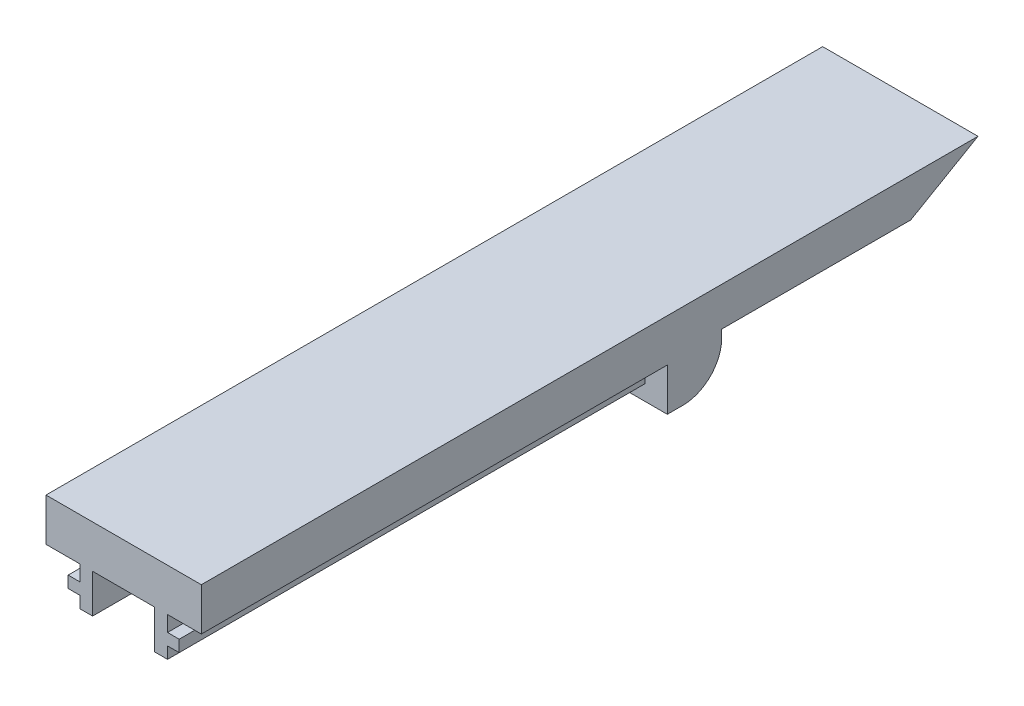
ISO-10303-21;
HEADER;
FILE_DESCRIPTION(('STEP AP214'),'2;1');
FILE_NAME('part.step','',(''),(''),'','','');
FILE_SCHEMA(('AUTOMOTIVE_DESIGN { 1 0 10303 214 1 1 1 1 }'));
ENDSEC;
DATA;
#1=APPLICATION_CONTEXT('core data for automotive mechanical design processes');
#2=APPLICATION_PROTOCOL_DEFINITION('international standard','automotive_design',2000,#1);
#3=PRODUCT_CONTEXT('',#1,'mechanical');
#4=PRODUCT('Part','Part','',(#3));
#5=PRODUCT_RELATED_PRODUCT_CATEGORY('part','',(#4));
#6=PRODUCT_DEFINITION_FORMATION('','',#4);
#7=PRODUCT_DEFINITION_CONTEXT('part definition',#1,'design');
#8=PRODUCT_DEFINITION('design','',#6,#7);
#9=PRODUCT_DEFINITION_SHAPE('','',#8);
#10=(LENGTH_UNIT() NAMED_UNIT(*) SI_UNIT(.MILLI.,.METRE.));
#11=(NAMED_UNIT(*) PLANE_ANGLE_UNIT() SI_UNIT($,.RADIAN.));
#12=(NAMED_UNIT(*) SI_UNIT($,.STERADIAN.) SOLID_ANGLE_UNIT());
#13=UNCERTAINTY_MEASURE_WITH_UNIT(LENGTH_MEASURE(1.E-05),#10,'distance_accuracy_value','');
#14=(GEOMETRIC_REPRESENTATION_CONTEXT(3) GLOBAL_UNCERTAINTY_ASSIGNED_CONTEXT((#13)) GLOBAL_UNIT_ASSIGNED_CONTEXT((#10,
#11,#12)) REPRESENTATION_CONTEXT('',''));
#15=CARTESIAN_POINT('',(0.,0.,0.));
#16=DIRECTION('',(0.,0.,1.));
#17=DIRECTION('',(1.,0.,0.));
#18=AXIS2_PLACEMENT_3D('',#15,#16,#17);
#19=CARTESIAN_POINT('',(0.,-33.3836724238589,-19.2740722604533));
#20=DIRECTION('',(0.,-0.866025403784438,-0.500000000000001));
#21=DIRECTION('',(0.,0.500000000000001,-0.866025403784438));
#22=AXIS2_PLACEMENT_3D('',#19,#20,#21);
#23=PLANE('',#22);
#24=DIRECTION('',(0.,0.500000000000001,-0.866025403784438));
#25=VECTOR('',#24,1.);
#26=CARTESIAN_POINT('',(-6.53631284916201,12.4734636871508,-98.7009618943233));
#27=LINE('',#26,#25);
#28=CARTESIAN_POINT('',(-6.53631284916201,8.22346368715084,-91.3397459621556));
#29=VERTEX_POINT('',#28);
#30=CARTESIAN_POINT('',(-6.53631284916201,13.2234636871508,-100.));
#31=VERTEX_POINT('',#30);
#32=EDGE_CURVE('E231',#29,#31,#27,.T.);
#33=ORIENTED_EDGE('',*,*,#32,.F.);
#34=DIRECTION('',(-1.,0.,0.));
#35=VECTOR('',#34,1.);
#36=CARTESIAN_POINT('',(0.,8.22346368715084,-91.3397459621556));
#37=LINE('',#36,#35);
#38=CARTESIAN_POINT('',(-26.536312849162,8.22346368715084,-91.3397459621556));
#39=VERTEX_POINT('',#38);
#40=EDGE_CURVE('E210',#29,#39,#37,.T.);
#41=ORIENTED_EDGE('',*,*,#40,.T.);
#42=DIRECTION('',(0.,-0.500000000000001,0.866025403784438));
#43=VECTOR('',#42,1.);
#44=CARTESIAN_POINT('',(-26.536312849162,12.4734636871508,-98.7009618943233));
#45=LINE('',#44,#43);
#46=CARTESIAN_POINT('',(-26.536312849162,13.2234636871508,-100.));
#47=VERTEX_POINT('',#46);
#48=EDGE_CURVE('E236',#47,#39,#45,.T.);
#49=ORIENTED_EDGE('',*,*,#48,.F.);
#50=DIRECTION('',(-1.,0.,0.));
#51=VECTOR('',#50,1.);
#52=CARTESIAN_POINT('',(-6.53631284916201,13.2234636871508,-100.));
#53=LINE('',#52,#51);
#54=EDGE_CURVE('E252',#31,#47,#53,.T.);
#55=ORIENTED_EDGE('',*,*,#54,.F.);
#56=EDGE_LOOP('',(#33,#41,#49,#55));
#57=FACE_BOUND('',#56,.T.);
#58=ADVANCED_FACE('F38',(#57),#23,.T.);
#59=CARTESIAN_POINT('',(-26.536312849162,2.22346368715084,-100.));
#60=DIRECTION('',(0.,-1.,0.));
#61=DIRECTION('',(0.,0.,-1.));
#62=AXIS2_PLACEMENT_3D('',#59,#60,#61);
#63=PLANE('',#62);
#64=DIRECTION('',(0.,0.,1.));
#65=VECTOR('',#64,1.);
#66=CARTESIAN_POINT('',(-26.536312849162,2.22346368715084,-100.));
#67=LINE('',#66,#65);
#68=CARTESIAN_POINT('',(-26.536312849162,2.22346368715084,-62.));
#69=VERTEX_POINT('',#68);
#70=CARTESIAN_POINT('',(-26.536312849162,2.22346368715084,-60.));
#71=VERTEX_POINT('',#70);
#72=EDGE_CURVE('E465',#69,#71,#67,.T.);
#73=ORIENTED_EDGE('',*,*,#72,.F.);
#74=DIRECTION('',(-1.,0.,0.));
#75=VECTOR('',#74,1.);
#76=CARTESIAN_POINT('',(-6.53631284916201,2.22346368715084,-62.));
#77=LINE('',#76,#75);
#78=CARTESIAN_POINT('',(-6.53631284916201,2.22346368715084,-62.));
#79=VERTEX_POINT('',#78);
#80=EDGE_CURVE('E47',#69,#79,#77,.F.);
#81=ORIENTED_EDGE('',*,*,#80,.T.);
#82=DIRECTION('',(0.,0.,1.));
#83=VECTOR('',#82,1.);
#84=CARTESIAN_POINT('',(-6.53631284916201,2.22346368715084,-100.));
#85=LINE('',#84,#83);
#86=CARTESIAN_POINT('',(-6.53631284916201,2.22346368715084,-60.));
#87=VERTEX_POINT('',#86);
#88=EDGE_CURVE('E466',#79,#87,#85,.T.);
#89=ORIENTED_EDGE('',*,*,#88,.T.);
#90=DIRECTION('',(1.,0.,0.));
#91=VECTOR('',#90,1.);
#92=CARTESIAN_POINT('',(-26.536312849162,2.22346368715084,-60.));
#93=LINE('',#92,#91);
#94=EDGE_CURVE('E261',#71,#87,#93,.T.);
#95=ORIENTED_EDGE('',*,*,#94,.F.);
#96=EDGE_LOOP('',(#73,#81,#89,#95));
#97=FACE_BOUND('',#96,.T.);
#98=ADVANCED_FACE('F505',(#97),#63,.T.);
#99=CARTESIAN_POINT('',(-26.536312849162,10.2234636871508,-100.));
#100=DIRECTION('',(-1.,0.,0.));
#101=DIRECTION('',(0.,0.,1.));
#102=AXIS2_PLACEMENT_3D('',#99,#100,#101);
#103=PLANE('',#102);
#104=DIRECTION('',(0.,-1.,0.));
#105=VECTOR('',#104,1.);
#106=CARTESIAN_POINT('',(-26.536312849162,8.22346368715084,-67.));
#107=LINE('',#106,#105);
#108=CARTESIAN_POINT('',(-26.536312849162,8.22346368715084,-67.));
#109=VERTEX_POINT('',#108);
#110=CARTESIAN_POINT('',(-26.536312849162,7.22346368715084,-67.));
#111=VERTEX_POINT('',#110);
#112=EDGE_CURVE('E223',#109,#111,#107,.T.);
#113=ORIENTED_EDGE('',*,*,#112,.T.);
#114=CARTESIAN_POINT('',(-26.536312849162,7.22346368715084,-62.));
#115=DIRECTION('',(-1.,0.,0.));
#116=DIRECTION('',(0.,0.,1.));
#117=AXIS2_PLACEMENT_3D('',#114,#115,#116);
#118=CIRCLE('',#117,5.);
#119=EDGE_CURVE('E61',#111,#69,#118,.T.);
#120=ORIENTED_EDGE('',*,*,#119,.T.);
#121=ORIENTED_EDGE('',*,*,#72,.T.);
#122=DIRECTION('',(0.,-1.,0.));
#123=VECTOR('',#122,1.);
#124=CARTESIAN_POINT('',(-26.536312849162,7.72346368715084,-60.));
#125=LINE('',#124,#123);
#126=CARTESIAN_POINT('',(-26.536312849162,7.72346368715084,-60.));
#127=VERTEX_POINT('',#126);
#128=EDGE_CURVE('E257',#127,#71,#125,.T.);
#129=ORIENTED_EDGE('',*,*,#128,.F.);
#130=DIRECTION('',(0.,0.,1.));
#131=VECTOR('',#130,1.);
#132=CARTESIAN_POINT('',(-26.536312849162,7.72346368715084,-60.));
#133=LINE('',#132,#131);
#134=CARTESIAN_POINT('',(-26.536312849162,7.72346368715084,0.));
#135=VERTEX_POINT('',#134);
#136=EDGE_CURVE('E404',#127,#135,#133,.T.);
#137=ORIENTED_EDGE('',*,*,#136,.T.);
#138=DIRECTION('',(0.,-1.,0.));
#139=VECTOR('',#138,1.);
#140=CARTESIAN_POINT('',(-26.536312849162,10.2234636871508,0.));
#141=LINE('',#140,#139);
#142=CARTESIAN_POINT('',(-26.536312849162,13.2234636871508,0.));
#143=VERTEX_POINT('',#142);
#144=EDGE_CURVE('E408',#143,#135,#141,.T.);
#145=ORIENTED_EDGE('',*,*,#144,.F.);
#146=DIRECTION('',(0.,0.,1.));
#147=VECTOR('',#146,1.);
#148=CARTESIAN_POINT('',(-26.536312849162,13.2234636871508,-100.));
#149=LINE('',#148,#147);
#150=EDGE_CURVE('E240',#47,#143,#149,.T.);
#151=ORIENTED_EDGE('',*,*,#150,.F.);
#152=ORIENTED_EDGE('',*,*,#48,.T.);
#153=DIRECTION('',(0.,0.,-1.));
#154=VECTOR('',#153,1.);
#155=CARTESIAN_POINT('',(-26.536312849162,8.22346368715084,-67.));
#156=LINE('',#155,#154);
#157=EDGE_CURVE('E215',#109,#39,#156,.T.);
#158=ORIENTED_EDGE('',*,*,#157,.F.);
#159=EDGE_LOOP('',(#113,#120,#121,#129,#137,#145,#151,#152,#158));
#160=FACE_BOUND('',#159,.T.);
#161=ADVANCED_FACE('F479',(#160),#103,.T.);
#162=CARTESIAN_POINT('',(-6.53631284916201,10.2234636871508,-100.));
#163=DIRECTION('',(1.,0.,0.));
#164=DIRECTION('',(0.,1.,0.));
#165=AXIS2_PLACEMENT_3D('',#162,#163,#164);
#166=PLANE('',#165);
#167=ORIENTED_EDGE('',*,*,#88,.F.);
#168=CARTESIAN_POINT('',(-6.53631284916201,7.22346368715084,-62.));
#169=DIRECTION('',(1.,0.,0.));
#170=DIRECTION('',(0.,1.,0.));
#171=AXIS2_PLACEMENT_3D('',#168,#169,#170);
#172=CIRCLE('',#171,5.);
#173=CARTESIAN_POINT('',(-6.53631284916201,7.22346368715084,-67.));
#174=VERTEX_POINT('',#173);
#175=EDGE_CURVE('E11',#79,#174,#172,.T.);
#176=ORIENTED_EDGE('',*,*,#175,.T.);
#177=DIRECTION('',(0.,-1.,0.));
#178=VECTOR('',#177,1.);
#179=CARTESIAN_POINT('',(-6.53631284916201,8.22346368715084,-67.));
#180=LINE('',#179,#178);
#181=CARTESIAN_POINT('',(-6.53631284916201,8.22346368715084,-67.));
#182=VERTEX_POINT('',#181);
#183=EDGE_CURVE('E221',#182,#174,#180,.T.);
#184=ORIENTED_EDGE('',*,*,#183,.F.);
#185=DIRECTION('',(0.,0.,1.));
#186=VECTOR('',#185,1.);
#187=CARTESIAN_POINT('',(-6.53631284916201,8.22346368715084,-67.));
#188=LINE('',#187,#186);
#189=EDGE_CURVE('E204',#29,#182,#188,.T.);
#190=ORIENTED_EDGE('',*,*,#189,.F.);
#191=ORIENTED_EDGE('',*,*,#32,.T.);
#192=DIRECTION('',(0.,0.,-1.));
#193=VECTOR('',#192,1.);
#194=CARTESIAN_POINT('',(-6.53631284916201,13.2234636871508,0.));
#195=LINE('',#194,#193);
#196=CARTESIAN_POINT('',(-6.53631284916201,13.2234636871508,0.));
#197=VERTEX_POINT('',#196);
#198=EDGE_CURVE('E248',#197,#31,#195,.T.);
#199=ORIENTED_EDGE('',*,*,#198,.F.);
#200=DIRECTION('',(0.,1.,0.));
#201=VECTOR('',#200,1.);
#202=CARTESIAN_POINT('',(-6.53631284916201,10.2234636871508,0.));
#203=LINE('',#202,#201);
#204=CARTESIAN_POINT('',(-6.53631284916201,7.72346368715084,0.));
#205=VERTEX_POINT('',#204);
#206=EDGE_CURVE('E462',#205,#197,#203,.T.);
#207=ORIENTED_EDGE('',*,*,#206,.F.);
#208=DIRECTION('',(0.,0.,1.));
#209=VECTOR('',#208,1.);
#210=CARTESIAN_POINT('',(-6.53631284916202,7.72346368715084,-60.));
#211=LINE('',#210,#209);
#212=CARTESIAN_POINT('',(-6.53631284916202,7.72346368715084,-60.));
#213=VERTEX_POINT('',#212);
#214=EDGE_CURVE('E338',#213,#205,#211,.T.);
#215=ORIENTED_EDGE('',*,*,#214,.F.);
#216=DIRECTION('',(0.,1.,0.));
#217=VECTOR('',#216,1.);
#218=CARTESIAN_POINT('',(-6.53631284916202,7.72346368715084,-60.));
#219=LINE('',#218,#217);
#220=EDGE_CURVE('E266',#87,#213,#219,.T.);
#221=ORIENTED_EDGE('',*,*,#220,.F.);
#222=EDGE_LOOP('',(#167,#176,#184,#190,#191,#199,#207,#215,#221));
#223=FACE_BOUND('',#222,.T.);
#224=ADVANCED_FACE('F226',(#223),#166,.T.);
#225=CARTESIAN_POINT('',(0.,0.,0.));
#226=DIRECTION('',(0.,0.,1.));
#227=DIRECTION('',(1.,0.,0.));
#228=AXIS2_PLACEMENT_3D('',#225,#226,#227);
#229=PLANE('',#228);
#230=DIRECTION('',(-1.,0.,0.));
#231=VECTOR('',#230,1.);
#232=CARTESIAN_POINT('',(-26.536312849162,7.72346368715084,0.));
#233=LINE('',#232,#231);
#234=CARTESIAN_POINT('',(-22.186312849162,7.72346368715084,0.));
#235=VERTEX_POINT('',#234);
#236=EDGE_CURVE('E262',#235,#135,#233,.T.);
#237=ORIENTED_EDGE('',*,*,#236,.F.);
#238=DIRECTION('',(0.,1.,0.));
#239=VECTOR('',#238,1.);
#240=CARTESIAN_POINT('',(-22.186312849162,7.72346368715084,0.));
#241=LINE('',#240,#239);
#242=CARTESIAN_POINT('',(-22.186312849162,5.72346368715084,0.));
#243=VERTEX_POINT('',#242);
#244=EDGE_CURVE('E398',#243,#235,#241,.T.);
#245=ORIENTED_EDGE('',*,*,#244,.F.);
#246=DIRECTION('',(1.,0.,0.));
#247=VECTOR('',#246,1.);
#248=CARTESIAN_POINT('',(-22.186312849162,5.72346368715084,0.));
#249=LINE('',#248,#247);
#250=CARTESIAN_POINT('',(-23.686312849162,5.72346368715084,0.));
#251=VERTEX_POINT('',#250);
#252=EDGE_CURVE('E394',#251,#243,#249,.T.);
#253=ORIENTED_EDGE('',*,*,#252,.F.);
#254=DIRECTION('',(0.,1.,0.));
#255=VECTOR('',#254,1.);
#256=CARTESIAN_POINT('',(-23.686312849162,5.72346368715084,0.));
#257=LINE('',#256,#255);
#258=CARTESIAN_POINT('',(-23.686312849162,4.22346368715084,0.));
#259=VERTEX_POINT('',#258);
#260=EDGE_CURVE('E390',#259,#251,#257,.T.);
#261=ORIENTED_EDGE('',*,*,#260,.F.);
#262=DIRECTION('',(-1.,0.,0.));
#263=VECTOR('',#262,1.);
#264=CARTESIAN_POINT('',(-23.686312849162,4.22346368715084,0.));
#265=LINE('',#264,#263);
#266=CARTESIAN_POINT('',(-22.186312849162,4.22346368715084,0.));
#267=VERTEX_POINT('',#266);
#268=EDGE_CURVE('E386',#267,#259,#265,.T.);
#269=ORIENTED_EDGE('',*,*,#268,.F.);
#270=DIRECTION('',(0.,1.,0.));
#271=VECTOR('',#270,1.);
#272=CARTESIAN_POINT('',(-22.186312849162,4.22346368715084,0.));
#273=LINE('',#272,#271);
#274=CARTESIAN_POINT('',(-22.186312849162,2.72346368715084,0.));
#275=VERTEX_POINT('',#274);
#276=EDGE_CURVE('E382',#275,#267,#273,.T.);
#277=ORIENTED_EDGE('',*,*,#276,.F.);
#278=DIRECTION('',(-1.,0.,0.));
#279=VECTOR('',#278,1.);
#280=CARTESIAN_POINT('',(-22.186312849162,2.72346368715084,0.));
#281=LINE('',#280,#279);
#282=CARTESIAN_POINT('',(-20.536312849162,2.72346368715084,0.));
#283=VERTEX_POINT('',#282);
#284=EDGE_CURVE('E378',#283,#275,#281,.T.);
#285=ORIENTED_EDGE('',*,*,#284,.F.);
#286=DIRECTION('',(0.,-1.,0.));
#287=VECTOR('',#286,1.);
#288=CARTESIAN_POINT('',(-20.536312849162,2.72346368715084,0.));
#289=LINE('',#288,#287);
#290=CARTESIAN_POINT('',(-20.536312849162,7.72346368715084,0.));
#291=VERTEX_POINT('',#290);
#292=EDGE_CURVE('E374',#291,#283,#289,.T.);
#293=ORIENTED_EDGE('',*,*,#292,.F.);
#294=DIRECTION('',(-1.,0.,0.));
#295=VECTOR('',#294,1.);
#296=CARTESIAN_POINT('',(-20.536312849162,7.72346368715084,0.));
#297=LINE('',#296,#295);
#298=CARTESIAN_POINT('',(-12.536312849162,7.72346368715084,0.));
#299=VERTEX_POINT('',#298);
#300=EDGE_CURVE('E370',#299,#291,#297,.T.);
#301=ORIENTED_EDGE('',*,*,#300,.F.);
#302=DIRECTION('',(0.,1.,0.));
#303=VECTOR('',#302,1.);
#304=CARTESIAN_POINT('',(-12.536312849162,2.72346368715084,0.));
#305=LINE('',#304,#303);
#306=CARTESIAN_POINT('',(-12.536312849162,2.72346368715084,0.));
#307=VERTEX_POINT('',#306);
#308=EDGE_CURVE('E366',#307,#299,#305,.T.);
#309=ORIENTED_EDGE('',*,*,#308,.F.);
#310=DIRECTION('',(-1.,0.,0.));
#311=VECTOR('',#310,1.);
#312=CARTESIAN_POINT('',(-10.886312849162,2.72346368715084,0.));
#313=LINE('',#312,#311);
#314=CARTESIAN_POINT('',(-10.886312849162,2.72346368715084,0.));
#315=VERTEX_POINT('',#314);
#316=EDGE_CURVE('E362',#315,#307,#313,.T.);
#317=ORIENTED_EDGE('',*,*,#316,.F.);
#318=DIRECTION('',(0.,-1.,0.));
#319=VECTOR('',#318,1.);
#320=CARTESIAN_POINT('',(-10.886312849162,4.22346368715084,0.));
#321=LINE('',#320,#319);
#322=CARTESIAN_POINT('',(-10.886312849162,4.22346368715084,0.));
#323=VERTEX_POINT('',#322);
#324=EDGE_CURVE('E358',#323,#315,#321,.T.);
#325=ORIENTED_EDGE('',*,*,#324,.F.);
#326=DIRECTION('',(-1.,0.,0.));
#327=VECTOR('',#326,1.);
#328=CARTESIAN_POINT('',(-9.38631284916202,4.22346368715084,0.));
#329=LINE('',#328,#327);
#330=CARTESIAN_POINT('',(-9.38631284916202,4.22346368715084,0.));
#331=VERTEX_POINT('',#330);
#332=EDGE_CURVE('E354',#331,#323,#329,.T.);
#333=ORIENTED_EDGE('',*,*,#332,.F.);
#334=DIRECTION('',(0.,-1.,0.));
#335=VECTOR('',#334,1.);
#336=CARTESIAN_POINT('',(-9.38631284916202,5.72346368715084,0.));
#337=LINE('',#336,#335);
#338=CARTESIAN_POINT('',(-9.38631284916202,5.72346368715084,0.));
#339=VERTEX_POINT('',#338);
#340=EDGE_CURVE('E350',#339,#331,#337,.T.);
#341=ORIENTED_EDGE('',*,*,#340,.F.);
#342=DIRECTION('',(1.,0.,0.));
#343=VECTOR('',#342,1.);
#344=CARTESIAN_POINT('',(-10.886312849162,5.72346368715084,0.));
#345=LINE('',#344,#343);
#346=CARTESIAN_POINT('',(-10.886312849162,5.72346368715084,0.));
#347=VERTEX_POINT('',#346);
#348=EDGE_CURVE('E346',#347,#339,#345,.T.);
#349=ORIENTED_EDGE('',*,*,#348,.F.);
#350=DIRECTION('',(0.,-1.,0.));
#351=VECTOR('',#350,1.);
#352=CARTESIAN_POINT('',(-10.886312849162,7.72346368715084,0.));
#353=LINE('',#352,#351);
#354=CARTESIAN_POINT('',(-10.886312849162,7.72346368715084,0.));
#355=VERTEX_POINT('',#354);
#356=EDGE_CURVE('E342',#355,#347,#353,.T.);
#357=ORIENTED_EDGE('',*,*,#356,.F.);
#358=DIRECTION('',(-1.,0.,0.));
#359=VECTOR('',#358,1.);
#360=CARTESIAN_POINT('',(-6.53631284916202,7.72346368715084,0.));
#361=LINE('',#360,#359);
#362=EDGE_CURVE('E256',#205,#355,#361,.T.);
#363=ORIENTED_EDGE('',*,*,#362,.F.);
#364=ORIENTED_EDGE('',*,*,#206,.T.);
#365=DIRECTION('',(1.,0.,0.));
#366=VECTOR('',#365,1.);
#367=CARTESIAN_POINT('',(-26.536312849162,13.2234636871508,0.));
#368=LINE('',#367,#366);
#369=EDGE_CURVE('E244',#143,#197,#368,.T.);
#370=ORIENTED_EDGE('',*,*,#369,.F.);
#371=ORIENTED_EDGE('',*,*,#144,.T.);
#372=EDGE_LOOP('',(#237,#245,#253,#261,#269,#277,#285,#293,#301,#309,#317,#325,#333,#341,#349,
#357,#363,#364,#370,#371));
#373=FACE_BOUND('',#372,.T.);
#374=ADVANCED_FACE('F493',(#373),#229,.T.);
#375=CARTESIAN_POINT('',(-26.536312849162,7.72346368715084,-60.));
#376=DIRECTION('',(0.,1.,0.));
#377=DIRECTION('',(0.,0.,1.));
#378=AXIS2_PLACEMENT_3D('',#375,#376,#377);
#379=PLANE('',#378);
#380=ORIENTED_EDGE('',*,*,#236,.T.);
#381=ORIENTED_EDGE('',*,*,#136,.F.);
#382=DIRECTION('',(-1.,0.,0.));
#383=VECTOR('',#382,1.);
#384=CARTESIAN_POINT('',(-26.536312849162,7.72346368715084,-60.));
#385=LINE('',#384,#383);
#386=CARTESIAN_POINT('',(-22.186312849162,7.72346368715084,-60.));
#387=VERTEX_POINT('',#386);
#388=EDGE_CURVE('E334',#387,#127,#385,.T.);
#389=ORIENTED_EDGE('',*,*,#388,.F.);
#390=DIRECTION('',(0.,0.,1.));
#391=VECTOR('',#390,1.);
#392=CARTESIAN_POINT('',(-22.186312849162,7.72346368715084,-60.));
#393=LINE('',#392,#391);
#394=EDGE_CURVE('E409',#387,#235,#393,.T.);
#395=ORIENTED_EDGE('',*,*,#394,.T.);
#396=EDGE_LOOP('',(#380,#381,#389,#395));
#397=FACE_BOUND('',#396,.T.);
#398=ADVANCED_FACE('F524',(#397),#379,.F.);
#399=CARTESIAN_POINT('',(-22.186312849162,7.72346368715084,-60.));
#400=DIRECTION('',(1.,0.,0.));
#401=DIRECTION('',(0.,1.,0.));
#402=AXIS2_PLACEMENT_3D('',#399,#400,#401);
#403=PLANE('',#402);
#404=ORIENTED_EDGE('',*,*,#244,.T.);
#405=ORIENTED_EDGE('',*,*,#394,.F.);
#406=DIRECTION('',(0.,1.,0.));
#407=VECTOR('',#406,1.);
#408=CARTESIAN_POINT('',(-22.186312849162,7.72346368715084,-60.));
#409=LINE('',#408,#407);
#410=CARTESIAN_POINT('',(-22.186312849162,5.72346368715084,-60.));
#411=VERTEX_POINT('',#410);
#412=EDGE_CURVE('E330',#411,#387,#409,.T.);
#413=ORIENTED_EDGE('',*,*,#412,.F.);
#414=DIRECTION('',(0.,0.,1.));
#415=VECTOR('',#414,1.);
#416=CARTESIAN_POINT('',(-22.186312849162,5.72346368715084,-60.));
#417=LINE('',#416,#415);
#418=EDGE_CURVE('E412',#411,#243,#417,.T.);
#419=ORIENTED_EDGE('',*,*,#418,.T.);
#420=EDGE_LOOP('',(#404,#405,#413,#419));
#421=FACE_BOUND('',#420,.T.);
#422=ADVANCED_FACE('F527',(#421),#403,.F.);
#423=CARTESIAN_POINT('',(-22.186312849162,5.72346368715084,-60.));
#424=DIRECTION('',(0.,-1.,0.));
#425=DIRECTION('',(0.,0.,-1.));
#426=AXIS2_PLACEMENT_3D('',#423,#424,#425);
#427=PLANE('',#426);
#428=ORIENTED_EDGE('',*,*,#252,.T.);
#429=ORIENTED_EDGE('',*,*,#418,.F.);
#430=DIRECTION('',(1.,0.,0.));
#431=VECTOR('',#430,1.);
#432=CARTESIAN_POINT('',(-22.186312849162,5.72346368715084,-60.));
#433=LINE('',#432,#431);
#434=CARTESIAN_POINT('',(-23.686312849162,5.72346368715084,-60.));
#435=VERTEX_POINT('',#434);
#436=EDGE_CURVE('E326',#435,#411,#433,.T.);
#437=ORIENTED_EDGE('',*,*,#436,.F.);
#438=DIRECTION('',(0.,0.,1.));
#439=VECTOR('',#438,1.);
#440=CARTESIAN_POINT('',(-23.686312849162,5.72346368715084,-60.));
#441=LINE('',#440,#439);
#442=EDGE_CURVE('E415',#435,#251,#441,.T.);
#443=ORIENTED_EDGE('',*,*,#442,.T.);
#444=EDGE_LOOP('',(#428,#429,#437,#443));
#445=FACE_BOUND('',#444,.T.);
#446=ADVANCED_FACE('F531',(#445),#427,.F.);
#447=CARTESIAN_POINT('',(-23.686312849162,5.72346368715084,-60.));
#448=DIRECTION('',(1.,0.,0.));
#449=DIRECTION('',(0.,0.,-1.));
#450=AXIS2_PLACEMENT_3D('',#447,#448,#449);
#451=PLANE('',#450);
#452=ORIENTED_EDGE('',*,*,#260,.T.);
#453=ORIENTED_EDGE('',*,*,#442,.F.);
#454=DIRECTION('',(0.,1.,0.));
#455=VECTOR('',#454,1.);
#456=CARTESIAN_POINT('',(-23.686312849162,5.72346368715084,-60.));
#457=LINE('',#456,#455);
#458=CARTESIAN_POINT('',(-23.686312849162,4.22346368715084,-60.));
#459=VERTEX_POINT('',#458);
#460=EDGE_CURVE('E322',#459,#435,#457,.T.);
#461=ORIENTED_EDGE('',*,*,#460,.F.);
#462=DIRECTION('',(0.,0.,1.));
#463=VECTOR('',#462,1.);
#464=CARTESIAN_POINT('',(-23.686312849162,4.22346368715084,-60.));
#465=LINE('',#464,#463);
#466=EDGE_CURVE('E418',#459,#259,#465,.T.);
#467=ORIENTED_EDGE('',*,*,#466,.T.);
#468=EDGE_LOOP('',(#452,#453,#461,#467));
#469=FACE_BOUND('',#468,.T.);
#470=ADVANCED_FACE('F535',(#469),#451,.F.);
#471=CARTESIAN_POINT('',(-23.686312849162,4.22346368715084,-60.));
#472=DIRECTION('',(0.,1.,0.));
#473=DIRECTION('',(0.,0.,1.));
#474=AXIS2_PLACEMENT_3D('',#471,#472,#473);
#475=PLANE('',#474);
#476=ORIENTED_EDGE('',*,*,#268,.T.);
#477=ORIENTED_EDGE('',*,*,#466,.F.);
#478=DIRECTION('',(-1.,0.,0.));
#479=VECTOR('',#478,1.);
#480=CARTESIAN_POINT('',(-23.686312849162,4.22346368715084,-60.));
#481=LINE('',#480,#479);
#482=CARTESIAN_POINT('',(-22.186312849162,4.22346368715084,-60.));
#483=VERTEX_POINT('',#482);
#484=EDGE_CURVE('E318',#483,#459,#481,.T.);
#485=ORIENTED_EDGE('',*,*,#484,.F.);
#486=DIRECTION('',(0.,0.,1.));
#487=VECTOR('',#486,1.);
#488=CARTESIAN_POINT('',(-22.186312849162,4.22346368715084,-60.));
#489=LINE('',#488,#487);
#490=EDGE_CURVE('E421',#483,#267,#489,.T.);
#491=ORIENTED_EDGE('',*,*,#490,.T.);
#492=EDGE_LOOP('',(#476,#477,#485,#491));
#493=FACE_BOUND('',#492,.T.);
#494=ADVANCED_FACE('F539',(#493),#475,.F.);
#495=CARTESIAN_POINT('',(-22.186312849162,4.22346368715084,-60.));
#496=DIRECTION('',(1.,0.,0.));
#497=DIRECTION('',(0.,0.,-1.));
#498=AXIS2_PLACEMENT_3D('',#495,#496,#497);
#499=PLANE('',#498);
#500=ORIENTED_EDGE('',*,*,#276,.T.);
#501=ORIENTED_EDGE('',*,*,#490,.F.);
#502=DIRECTION('',(0.,1.,0.));
#503=VECTOR('',#502,1.);
#504=CARTESIAN_POINT('',(-22.186312849162,4.22346368715084,-60.));
#505=LINE('',#504,#503);
#506=CARTESIAN_POINT('',(-22.186312849162,2.72346368715084,-60.));
#507=VERTEX_POINT('',#506);
#508=EDGE_CURVE('E314',#507,#483,#505,.T.);
#509=ORIENTED_EDGE('',*,*,#508,.F.);
#510=DIRECTION('',(0.,0.,1.));
#511=VECTOR('',#510,1.);
#512=CARTESIAN_POINT('',(-22.186312849162,2.72346368715084,-60.));
#513=LINE('',#512,#511);
#514=EDGE_CURVE('E424',#507,#275,#513,.T.);
#515=ORIENTED_EDGE('',*,*,#514,.T.);
#516=EDGE_LOOP('',(#500,#501,#509,#515));
#517=FACE_BOUND('',#516,.T.);
#518=ADVANCED_FACE('F543',(#517),#499,.F.);
#519=CARTESIAN_POINT('',(-22.186312849162,2.72346368715084,-60.));
#520=DIRECTION('',(0.,1.,0.));
#521=DIRECTION('',(0.,0.,1.));
#522=AXIS2_PLACEMENT_3D('',#519,#520,#521);
#523=PLANE('',#522);
#524=ORIENTED_EDGE('',*,*,#284,.T.);
#525=ORIENTED_EDGE('',*,*,#514,.F.);
#526=DIRECTION('',(-1.,0.,0.));
#527=VECTOR('',#526,1.);
#528=CARTESIAN_POINT('',(-22.186312849162,2.72346368715084,-60.));
#529=LINE('',#528,#527);
#530=CARTESIAN_POINT('',(-20.536312849162,2.72346368715084,-60.));
#531=VERTEX_POINT('',#530);
#532=EDGE_CURVE('E310',#531,#507,#529,.T.);
#533=ORIENTED_EDGE('',*,*,#532,.F.);
#534=DIRECTION('',(0.,0.,1.));
#535=VECTOR('',#534,1.);
#536=CARTESIAN_POINT('',(-20.536312849162,2.72346368715084,-60.));
#537=LINE('',#536,#535);
#538=EDGE_CURVE('E427',#531,#283,#537,.T.);
#539=ORIENTED_EDGE('',*,*,#538,.T.);
#540=EDGE_LOOP('',(#524,#525,#533,#539));
#541=FACE_BOUND('',#540,.T.);
#542=ADVANCED_FACE('F547',(#541),#523,.F.);
#543=CARTESIAN_POINT('',(-20.536312849162,2.72346368715084,-60.));
#544=DIRECTION('',(-1.,0.,0.));
#545=DIRECTION('',(0.,0.,1.));
#546=AXIS2_PLACEMENT_3D('',#543,#544,#545);
#547=PLANE('',#546);
#548=ORIENTED_EDGE('',*,*,#292,.T.);
#549=ORIENTED_EDGE('',*,*,#538,.F.);
#550=DIRECTION('',(0.,-1.,0.));
#551=VECTOR('',#550,1.);
#552=CARTESIAN_POINT('',(-20.536312849162,2.72346368715084,-60.));
#553=LINE('',#552,#551);
#554=CARTESIAN_POINT('',(-20.536312849162,7.72346368715084,-60.));
#555=VERTEX_POINT('',#554);
#556=EDGE_CURVE('E306',#555,#531,#553,.T.);
#557=ORIENTED_EDGE('',*,*,#556,.F.);
#558=DIRECTION('',(0.,0.,1.));
#559=VECTOR('',#558,1.);
#560=CARTESIAN_POINT('',(-20.536312849162,7.72346368715084,-60.));
#561=LINE('',#560,#559);
#562=EDGE_CURVE('E430',#555,#291,#561,.T.);
#563=ORIENTED_EDGE('',*,*,#562,.T.);
#564=EDGE_LOOP('',(#548,#549,#557,#563));
#565=FACE_BOUND('',#564,.T.);
#566=ADVANCED_FACE('F551',(#565),#547,.F.);
#567=CARTESIAN_POINT('',(-20.536312849162,7.72346368715084,-60.));
#568=DIRECTION('',(0.,1.,0.));
#569=DIRECTION('',(0.,0.,1.));
#570=AXIS2_PLACEMENT_3D('',#567,#568,#569);
#571=PLANE('',#570);
#572=ORIENTED_EDGE('',*,*,#300,.T.);
#573=ORIENTED_EDGE('',*,*,#562,.F.);
#574=DIRECTION('',(-1.,0.,0.));
#575=VECTOR('',#574,1.);
#576=CARTESIAN_POINT('',(-20.536312849162,7.72346368715084,-60.));
#577=LINE('',#576,#575);
#578=CARTESIAN_POINT('',(-12.536312849162,7.72346368715084,-60.));
#579=VERTEX_POINT('',#578);
#580=EDGE_CURVE('E302',#579,#555,#577,.T.);
#581=ORIENTED_EDGE('',*,*,#580,.F.);
#582=DIRECTION('',(0.,0.,1.));
#583=VECTOR('',#582,1.);
#584=CARTESIAN_POINT('',(-12.536312849162,7.72346368715084,-60.));
#585=LINE('',#584,#583);
#586=EDGE_CURVE('E433',#579,#299,#585,.T.);
#587=ORIENTED_EDGE('',*,*,#586,.T.);
#588=EDGE_LOOP('',(#572,#573,#581,#587));
#589=FACE_BOUND('',#588,.T.);
#590=ADVANCED_FACE('F555',(#589),#571,.F.);
#591=CARTESIAN_POINT('',(-12.536312849162,2.72346368715084,-60.));
#592=DIRECTION('',(1.,0.,0.));
#593=DIRECTION('',(0.,0.,-1.));
#594=AXIS2_PLACEMENT_3D('',#591,#592,#593);
#595=PLANE('',#594);
#596=ORIENTED_EDGE('',*,*,#308,.T.);
#597=ORIENTED_EDGE('',*,*,#586,.F.);
#598=DIRECTION('',(0.,1.,0.));
#599=VECTOR('',#598,1.);
#600=CARTESIAN_POINT('',(-12.536312849162,2.72346368715084,-60.));
#601=LINE('',#600,#599);
#602=CARTESIAN_POINT('',(-12.536312849162,2.72346368715084,-60.));
#603=VERTEX_POINT('',#602);
#604=EDGE_CURVE('E298',#603,#579,#601,.T.);
#605=ORIENTED_EDGE('',*,*,#604,.F.);
#606=DIRECTION('',(0.,0.,1.));
#607=VECTOR('',#606,1.);
#608=CARTESIAN_POINT('',(-12.536312849162,2.72346368715084,-60.));
#609=LINE('',#608,#607);
#610=EDGE_CURVE('E436',#603,#307,#609,.T.);
#611=ORIENTED_EDGE('',*,*,#610,.T.);
#612=EDGE_LOOP('',(#596,#597,#605,#611));
#613=FACE_BOUND('',#612,.T.);
#614=ADVANCED_FACE('F559',(#613),#595,.F.);
#615=CARTESIAN_POINT('',(-10.886312849162,2.72346368715084,-60.));
#616=DIRECTION('',(0.,1.,0.));
#617=DIRECTION('',(0.,0.,1.));
#618=AXIS2_PLACEMENT_3D('',#615,#616,#617);
#619=PLANE('',#618);
#620=ORIENTED_EDGE('',*,*,#316,.T.);
#621=ORIENTED_EDGE('',*,*,#610,.F.);
#622=DIRECTION('',(-1.,0.,0.));
#623=VECTOR('',#622,1.);
#624=CARTESIAN_POINT('',(-10.886312849162,2.72346368715084,-60.));
#625=LINE('',#624,#623);
#626=CARTESIAN_POINT('',(-10.886312849162,2.72346368715084,-60.));
#627=VERTEX_POINT('',#626);
#628=EDGE_CURVE('E294',#627,#603,#625,.T.);
#629=ORIENTED_EDGE('',*,*,#628,.F.);
#630=DIRECTION('',(0.,0.,1.));
#631=VECTOR('',#630,1.);
#632=CARTESIAN_POINT('',(-10.886312849162,2.72346368715084,-60.));
#633=LINE('',#632,#631);
#634=EDGE_CURVE('E439',#627,#315,#633,.T.);
#635=ORIENTED_EDGE('',*,*,#634,.T.);
#636=EDGE_LOOP('',(#620,#621,#629,#635));
#637=FACE_BOUND('',#636,.T.);
#638=ADVANCED_FACE('F563',(#637),#619,.F.);
#639=CARTESIAN_POINT('',(-10.886312849162,4.22346368715084,-60.));
#640=DIRECTION('',(-1.,0.,0.));
#641=DIRECTION('',(0.,0.,1.));
#642=AXIS2_PLACEMENT_3D('',#639,#640,#641);
#643=PLANE('',#642);
#644=ORIENTED_EDGE('',*,*,#324,.T.);
#645=ORIENTED_EDGE('',*,*,#634,.F.);
#646=DIRECTION('',(0.,-1.,0.));
#647=VECTOR('',#646,1.);
#648=CARTESIAN_POINT('',(-10.886312849162,4.22346368715084,-60.));
#649=LINE('',#648,#647);
#650=CARTESIAN_POINT('',(-10.886312849162,4.22346368715084,-60.));
#651=VERTEX_POINT('',#650);
#652=EDGE_CURVE('E290',#651,#627,#649,.T.);
#653=ORIENTED_EDGE('',*,*,#652,.F.);
#654=DIRECTION('',(0.,0.,1.));
#655=VECTOR('',#654,1.);
#656=CARTESIAN_POINT('',(-10.886312849162,4.22346368715084,-60.));
#657=LINE('',#656,#655);
#658=EDGE_CURVE('E442',#651,#323,#657,.T.);
#659=ORIENTED_EDGE('',*,*,#658,.T.);
#660=EDGE_LOOP('',(#644,#645,#653,#659));
#661=FACE_BOUND('',#660,.T.);
#662=ADVANCED_FACE('F567',(#661),#643,.F.);
#663=CARTESIAN_POINT('',(-9.38631284916202,4.22346368715084,-60.));
#664=DIRECTION('',(0.,1.,0.));
#665=DIRECTION('',(0.,0.,1.));
#666=AXIS2_PLACEMENT_3D('',#663,#664,#665);
#667=PLANE('',#666);
#668=ORIENTED_EDGE('',*,*,#332,.T.);
#669=ORIENTED_EDGE('',*,*,#658,.F.);
#670=DIRECTION('',(-1.,0.,0.));
#671=VECTOR('',#670,1.);
#672=CARTESIAN_POINT('',(-9.38631284916202,4.22346368715084,-60.));
#673=LINE('',#672,#671);
#674=CARTESIAN_POINT('',(-9.38631284916202,4.22346368715084,-60.));
#675=VERTEX_POINT('',#674);
#676=EDGE_CURVE('E286',#675,#651,#673,.T.);
#677=ORIENTED_EDGE('',*,*,#676,.F.);
#678=DIRECTION('',(0.,0.,1.));
#679=VECTOR('',#678,1.);
#680=CARTESIAN_POINT('',(-9.38631284916202,4.22346368715084,-60.));
#681=LINE('',#680,#679);
#682=EDGE_CURVE('E445',#675,#331,#681,.T.);
#683=ORIENTED_EDGE('',*,*,#682,.T.);
#684=EDGE_LOOP('',(#668,#669,#677,#683));
#685=FACE_BOUND('',#684,.T.);
#686=ADVANCED_FACE('F571',(#685),#667,.F.);
#687=CARTESIAN_POINT('',(-9.38631284916202,5.72346368715084,-60.));
#688=DIRECTION('',(-1.,0.,0.));
#689=DIRECTION('',(0.,0.,1.));
#690=AXIS2_PLACEMENT_3D('',#687,#688,#689);
#691=PLANE('',#690);
#692=ORIENTED_EDGE('',*,*,#340,.T.);
#693=ORIENTED_EDGE('',*,*,#682,.F.);
#694=DIRECTION('',(0.,-1.,0.));
#695=VECTOR('',#694,1.);
#696=CARTESIAN_POINT('',(-9.38631284916202,5.72346368715084,-60.));
#697=LINE('',#696,#695);
#698=CARTESIAN_POINT('',(-9.38631284916202,5.72346368715084,-60.));
#699=VERTEX_POINT('',#698);
#700=EDGE_CURVE('E282',#699,#675,#697,.T.);
#701=ORIENTED_EDGE('',*,*,#700,.F.);
#702=DIRECTION('',(0.,0.,1.));
#703=VECTOR('',#702,1.);
#704=CARTESIAN_POINT('',(-9.38631284916202,5.72346368715084,-60.));
#705=LINE('',#704,#703);
#706=EDGE_CURVE('E448',#699,#339,#705,.T.);
#707=ORIENTED_EDGE('',*,*,#706,.T.);
#708=EDGE_LOOP('',(#692,#693,#701,#707));
#709=FACE_BOUND('',#708,.T.);
#710=ADVANCED_FACE('F575',(#709),#691,.F.);
#711=CARTESIAN_POINT('',(-10.886312849162,5.72346368715084,-60.));
#712=DIRECTION('',(0.,-1.,0.));
#713=DIRECTION('',(0.,0.,-1.));
#714=AXIS2_PLACEMENT_3D('',#711,#712,#713);
#715=PLANE('',#714);
#716=ORIENTED_EDGE('',*,*,#348,.T.);
#717=ORIENTED_EDGE('',*,*,#706,.F.);
#718=DIRECTION('',(1.,0.,0.));
#719=VECTOR('',#718,1.);
#720=CARTESIAN_POINT('',(-10.886312849162,5.72346368715084,-60.));
#721=LINE('',#720,#719);
#722=CARTESIAN_POINT('',(-10.886312849162,5.72346368715084,-60.));
#723=VERTEX_POINT('',#722);
#724=EDGE_CURVE('E278',#723,#699,#721,.T.);
#725=ORIENTED_EDGE('',*,*,#724,.F.);
#726=DIRECTION('',(0.,0.,1.));
#727=VECTOR('',#726,1.);
#728=CARTESIAN_POINT('',(-10.886312849162,5.72346368715084,-60.));
#729=LINE('',#728,#727);
#730=EDGE_CURVE('E451',#723,#347,#729,.T.);
#731=ORIENTED_EDGE('',*,*,#730,.T.);
#732=EDGE_LOOP('',(#716,#717,#725,#731));
#733=FACE_BOUND('',#732,.T.);
#734=ADVANCED_FACE('F579',(#733),#715,.F.);
#735=CARTESIAN_POINT('',(-10.886312849162,7.72346368715084,-60.));
#736=DIRECTION('',(-1.,0.,0.));
#737=DIRECTION('',(0.,-1.,0.));
#738=AXIS2_PLACEMENT_3D('',#735,#736,#737);
#739=PLANE('',#738);
#740=ORIENTED_EDGE('',*,*,#356,.T.);
#741=ORIENTED_EDGE('',*,*,#730,.F.);
#742=DIRECTION('',(0.,-1.,0.));
#743=VECTOR('',#742,1.);
#744=CARTESIAN_POINT('',(-10.886312849162,7.72346368715084,-60.));
#745=LINE('',#744,#743);
#746=CARTESIAN_POINT('',(-10.886312849162,7.72346368715084,-60.));
#747=VERTEX_POINT('',#746);
#748=EDGE_CURVE('E274',#747,#723,#745,.T.);
#749=ORIENTED_EDGE('',*,*,#748,.F.);
#750=DIRECTION('',(0.,0.,1.));
#751=VECTOR('',#750,1.);
#752=CARTESIAN_POINT('',(-10.886312849162,7.72346368715084,-60.));
#753=LINE('',#752,#751);
#754=EDGE_CURVE('E454',#747,#355,#753,.T.);
#755=ORIENTED_EDGE('',*,*,#754,.T.);
#756=EDGE_LOOP('',(#740,#741,#749,#755));
#757=FACE_BOUND('',#756,.T.);
#758=ADVANCED_FACE('F583',(#757),#739,.F.);
#759=CARTESIAN_POINT('',(-6.53631284916202,7.72346368715084,-60.));
#760=DIRECTION('',(0.,1.,0.));
#761=DIRECTION('',(0.,0.,1.));
#762=AXIS2_PLACEMENT_3D('',#759,#760,#761);
#763=PLANE('',#762);
#764=ORIENTED_EDGE('',*,*,#362,.T.);
#765=ORIENTED_EDGE('',*,*,#754,.F.);
#766=DIRECTION('',(-1.,0.,0.));
#767=VECTOR('',#766,1.);
#768=CARTESIAN_POINT('',(-6.53631284916202,7.72346368715084,-60.));
#769=LINE('',#768,#767);
#770=EDGE_CURVE('E270',#213,#747,#769,.T.);
#771=ORIENTED_EDGE('',*,*,#770,.F.);
#772=ORIENTED_EDGE('',*,*,#214,.T.);
#773=EDGE_LOOP('',(#764,#765,#771,#772));
#774=FACE_BOUND('',#773,.T.);
#775=ADVANCED_FACE('F498',(#774),#763,.F.);
#776=CARTESIAN_POINT('',(0.,0.,-60.));
#777=DIRECTION('',(0.,0.,1.));
#778=DIRECTION('',(1.,0.,0.));
#779=AXIS2_PLACEMENT_3D('',#776,#777,#778);
#780=PLANE('',#779);
#781=ORIENTED_EDGE('',*,*,#128,.T.);
#782=ORIENTED_EDGE('',*,*,#94,.T.);
#783=ORIENTED_EDGE('',*,*,#220,.T.);
#784=ORIENTED_EDGE('',*,*,#770,.T.);
#785=ORIENTED_EDGE('',*,*,#748,.T.);
#786=ORIENTED_EDGE('',*,*,#724,.T.);
#787=ORIENTED_EDGE('',*,*,#700,.T.);
#788=ORIENTED_EDGE('',*,*,#676,.T.);
#789=ORIENTED_EDGE('',*,*,#652,.T.);
#790=ORIENTED_EDGE('',*,*,#628,.T.);
#791=ORIENTED_EDGE('',*,*,#604,.T.);
#792=ORIENTED_EDGE('',*,*,#580,.T.);
#793=ORIENTED_EDGE('',*,*,#556,.T.);
#794=ORIENTED_EDGE('',*,*,#532,.T.);
#795=ORIENTED_EDGE('',*,*,#508,.T.);
#796=ORIENTED_EDGE('',*,*,#484,.T.);
#797=ORIENTED_EDGE('',*,*,#460,.T.);
#798=ORIENTED_EDGE('',*,*,#436,.T.);
#799=ORIENTED_EDGE('',*,*,#412,.T.);
#800=ORIENTED_EDGE('',*,*,#388,.T.);
#801=EDGE_LOOP('',(#781,#782,#783,#784,#785,#786,#787,#788,#789,#790,#791,#792,#793,#794,#795,
#796,#797,#798,#799,#800));
#802=FACE_BOUND('',#801,.T.);
#803=ADVANCED_FACE('F502',(#802),#780,.T.);
#804=CARTESIAN_POINT('',(0.,13.2234636871508,0.));
#805=DIRECTION('',(0.,1.,0.));
#806=DIRECTION('',(0.,0.,1.));
#807=AXIS2_PLACEMENT_3D('',#804,#805,#806);
#808=PLANE('',#807);
#809=ORIENTED_EDGE('',*,*,#150,.T.);
#810=ORIENTED_EDGE('',*,*,#369,.T.);
#811=ORIENTED_EDGE('',*,*,#198,.T.);
#812=ORIENTED_EDGE('',*,*,#54,.T.);
#813=EDGE_LOOP('',(#809,#810,#811,#812));
#814=FACE_BOUND('',#813,.T.);
#815=ADVANCED_FACE('F489',(#814),#808,.T.);
#816=CARTESIAN_POINT('',(-26.536312849162,8.22346368715084,-67.));
#817=DIRECTION('',(0.,0.,1.));
#818=DIRECTION('',(1.,0.,0.));
#819=AXIS2_PLACEMENT_3D('',#816,#817,#818);
#820=PLANE('',#819);
#821=ORIENTED_EDGE('',*,*,#183,.T.);
#822=DIRECTION('',(-1.,0.,0.));
#823=VECTOR('',#822,1.);
#824=CARTESIAN_POINT('',(-26.536312849162,7.22346368715084,-67.));
#825=LINE('',#824,#823);
#826=EDGE_CURVE('E473',#174,#111,#825,.T.);
#827=ORIENTED_EDGE('',*,*,#826,.T.);
#828=ORIENTED_EDGE('',*,*,#112,.F.);
#829=DIRECTION('',(-1.,0.,0.));
#830=VECTOR('',#829,1.);
#831=CARTESIAN_POINT('',(-26.536312849162,8.22346368715084,-67.));
#832=LINE('',#831,#830);
#833=EDGE_CURVE('E207',#182,#109,#832,.T.);
#834=ORIENTED_EDGE('',*,*,#833,.F.);
#835=EDGE_LOOP('',(#821,#827,#828,#834));
#836=FACE_BOUND('',#835,.T.);
#837=ADVANCED_FACE('F219',(#836),#820,.F.);
#838=CARTESIAN_POINT('',(0.,8.22346368715084,0.));
#839=DIRECTION('',(0.,-1.,0.));
#840=DIRECTION('',(0.,0.,-1.));
#841=AXIS2_PLACEMENT_3D('',#838,#839,#840);
#842=PLANE('',#841);
#843=ORIENTED_EDGE('',*,*,#189,.T.);
#844=ORIENTED_EDGE('',*,*,#833,.T.);
#845=ORIENTED_EDGE('',*,*,#157,.T.);
#846=ORIENTED_EDGE('',*,*,#40,.F.);
#847=EDGE_LOOP('',(#843,#844,#845,#846));
#848=FACE_BOUND('',#847,.T.);
#849=ADVANCED_FACE('F206',(#848),#842,.T.);
#850=CARTESIAN_POINT('',(-26.536312849162,7.22346368715084,-62.));
#851=DIRECTION('',(1.,0.,0.));
#852=DIRECTION('',(0.,0.,-1.));
#853=AXIS2_PLACEMENT_3D('',#850,#851,#852);
#854=CYLINDRICAL_SURFACE('',#853,5.);
#855=ORIENTED_EDGE('',*,*,#175,.F.);
#856=ORIENTED_EDGE('',*,*,#80,.F.);
#857=ORIENTED_EDGE('',*,*,#119,.F.);
#858=ORIENTED_EDGE('',*,*,#826,.F.);
#859=EDGE_LOOP('',(#855,#856,#857,#858));
#860=FACE_BOUND('',#859,.T.);
#861=ADVANCED_FACE('F40',(#860),#854,.T.);
#862=CLOSED_SHELL('',(#58,#98,#161,#224,#374,#398,#422,#446,#470,#494,#518,#542,#566,#590,#614,
#638,#662,#686,#710,#734,#758,#775,#803,#815,#837,#849,#861));
#863=MANIFOLD_SOLID_BREP('B2',#862);
#864=ADVANCED_BREP_SHAPE_REPRESENTATION('',(#18,#863),#14);
#865=SHAPE_DEFINITION_REPRESENTATION(#9,#864);
ENDSEC;
END-ISO-10303-21;
